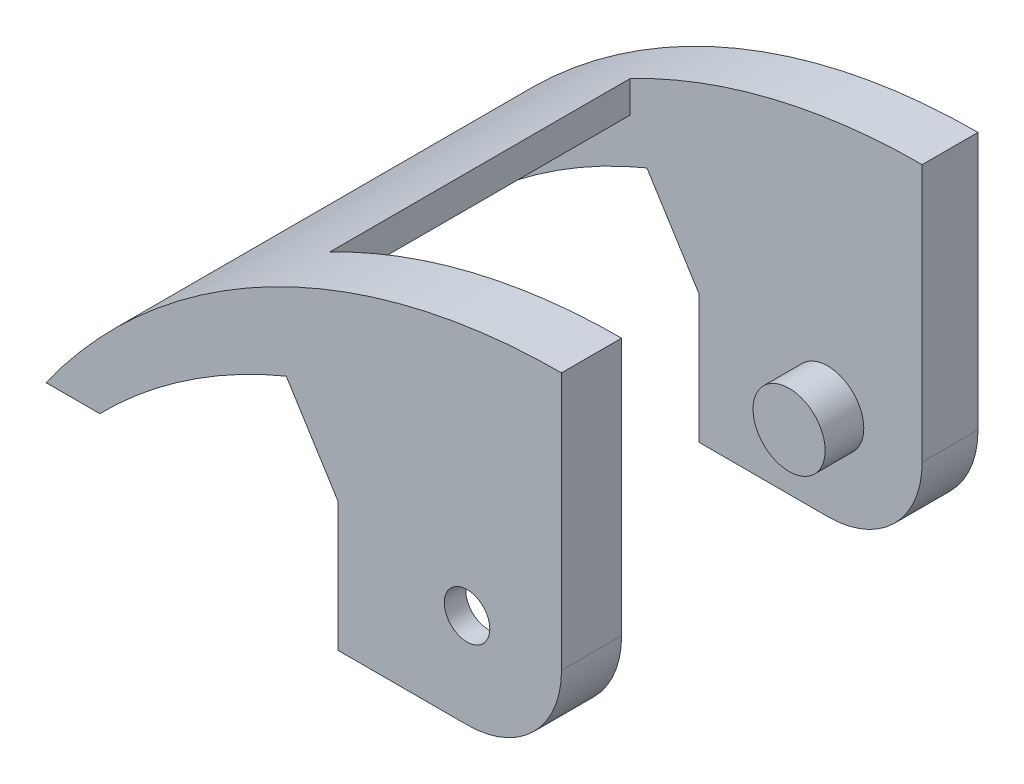
ISO-10303-21;
HEADER;
FILE_DESCRIPTION(('STEP AP214'),'2;1');
FILE_NAME('part.step','',(''),(''),'','','');
FILE_SCHEMA(('AUTOMOTIVE_DESIGN { 1 0 10303 214 1 1 1 1 }'));
ENDSEC;
DATA;
#1=APPLICATION_CONTEXT('core data for automotive mechanical design processes');
#2=APPLICATION_PROTOCOL_DEFINITION('international standard','automotive_design',2000,#1);
#3=PRODUCT_CONTEXT('',#1,'mechanical');
#4=PRODUCT('Part','Part','',(#3));
#5=PRODUCT_RELATED_PRODUCT_CATEGORY('part','',(#4));
#6=PRODUCT_DEFINITION_FORMATION('','',#4);
#7=PRODUCT_DEFINITION_CONTEXT('part definition',#1,'design');
#8=PRODUCT_DEFINITION('design','',#6,#7);
#9=PRODUCT_DEFINITION_SHAPE('','',#8);
#10=(LENGTH_UNIT() NAMED_UNIT(*) SI_UNIT(.MILLI.,.METRE.));
#11=(NAMED_UNIT(*) PLANE_ANGLE_UNIT() SI_UNIT($,.RADIAN.));
#12=(NAMED_UNIT(*) SI_UNIT($,.STERADIAN.) SOLID_ANGLE_UNIT());
#13=UNCERTAINTY_MEASURE_WITH_UNIT(LENGTH_MEASURE(1.E-05),#10,'distance_accuracy_value','');
#14=(GEOMETRIC_REPRESENTATION_CONTEXT(3) GLOBAL_UNCERTAINTY_ASSIGNED_CONTEXT((#13)) GLOBAL_UNIT_ASSIGNED_CONTEXT((#10,
#11,#12)) REPRESENTATION_CONTEXT('',''));
#15=CARTESIAN_POINT('',(0.,0.,0.));
#16=DIRECTION('',(0.,0.,1.));
#17=DIRECTION('',(1.,0.,0.));
#18=AXIS2_PLACEMENT_3D('',#15,#16,#17);
#19=CARTESIAN_POINT('',(0.,-11.,-7.));
#20=DIRECTION('',(0.,1.,0.));
#21=DIRECTION('',(-1.,0.,0.));
#22=AXIS2_PLACEMENT_3D('',#19,#20,#21);
#23=PLANE('',#22);
#24=DIRECTION('',(0.,0.,-1.));
#25=VECTOR('',#24,1.);
#26=CARTESIAN_POINT('',(-15.,-11.,0.));
#27=LINE('',#26,#25);
#28=CARTESIAN_POINT('',(-15.,-11.,-42.));
#29=VERTEX_POINT('',#28);
#30=CARTESIAN_POINT('',(-15.,-11.,-48.5));
#31=VERTEX_POINT('',#30);
#32=EDGE_CURVE('E243',#29,#31,#27,.T.);
#33=ORIENTED_EDGE('',*,*,#32,.T.);
#34=DIRECTION('',(-1.,0.,0.));
#35=VECTOR('',#34,1.);
#36=CARTESIAN_POINT('',(0.,-11.,-48.5));
#37=LINE('',#36,#35);
#38=CARTESIAN_POINT('',(0.,-11.,-48.5));
#39=VERTEX_POINT('',#38);
#40=EDGE_CURVE('E231',#39,#31,#37,.T.);
#41=ORIENTED_EDGE('',*,*,#40,.F.);
#42=DIRECTION('',(0.,0.,-1.));
#43=VECTOR('',#42,1.);
#44=CARTESIAN_POINT('',(0.,-11.,-41.5));
#45=LINE('',#44,#43);
#46=CARTESIAN_POINT('',(0.,-11.,-42.));
#47=VERTEX_POINT('',#46);
#48=EDGE_CURVE('E306',#47,#39,#45,.T.);
#49=ORIENTED_EDGE('',*,*,#48,.F.);
#50=DIRECTION('',(1.,0.,0.));
#51=VECTOR('',#50,1.);
#52=CARTESIAN_POINT('',(0.,-11.,-42.));
#53=LINE('',#52,#51);
#54=EDGE_CURVE('E287',#29,#47,#53,.T.);
#55=ORIENTED_EDGE('',*,*,#54,.F.);
#56=EDGE_LOOP('',(#33,#41,#49,#55));
#57=FACE_BOUND('',#56,.T.);
#58=ADVANCED_FACE('F47',(#57),#23,.F.);
#59=CARTESIAN_POINT('',(-15.,-11.,0.));
#60=VERTEX_POINT('',#59);
#61=CARTESIAN_POINT('',(-15.,-11.,-6.99999999999999));
#62=VERTEX_POINT('',#61);
#63=EDGE_CURVE('E241',#60,#62,#27,.T.);
#64=ORIENTED_EDGE('',*,*,#63,.T.);
#65=DIRECTION('',(-1.,0.,0.));
#66=VECTOR('',#65,1.);
#67=CARTESIAN_POINT('',(0.,-11.,-7.));
#68=LINE('',#67,#66);
#69=CARTESIAN_POINT('',(0.,-11.,-7.));
#70=VERTEX_POINT('',#69);
#71=EDGE_CURVE('E168',#70,#62,#68,.T.);
#72=ORIENTED_EDGE('',*,*,#71,.F.);
#73=DIRECTION('',(0.,0.,1.));
#74=VECTOR('',#73,1.);
#75=CARTESIAN_POINT('',(0.,-11.,-7.));
#76=LINE('',#75,#74);
#77=CARTESIAN_POINT('',(0.,-11.,0.));
#78=VERTEX_POINT('',#77);
#79=EDGE_CURVE('E172',#70,#78,#76,.T.);
#80=ORIENTED_EDGE('',*,*,#79,.T.);
#81=DIRECTION('',(-1.,0.,0.));
#82=VECTOR('',#81,1.);
#83=CARTESIAN_POINT('',(0.,-11.,0.));
#84=LINE('',#83,#82);
#85=EDGE_CURVE('E153',#78,#60,#84,.T.);
#86=ORIENTED_EDGE('',*,*,#85,.T.);
#87=EDGE_LOOP('',(#64,#72,#80,#86));
#88=FACE_BOUND('',#87,.T.);
#89=ADVANCED_FACE('F173',(#88),#23,.F.);
#90=CARTESIAN_POINT('',(0.,0.,-48.5));
#91=DIRECTION('',(0.,0.,1.));
#92=DIRECTION('',(1.,0.,0.));
#93=AXIS2_PLACEMENT_3D('',#90,#91,#92);
#94=CYLINDRICAL_SURFACE('',#93,11.);
#95=DIRECTION('',(0.,0.,1.));
#96=VECTOR('',#95,1.);
#97=CARTESIAN_POINT('',(11.,0.,-48.5));
#98=LINE('',#97,#96);
#99=CARTESIAN_POINT('',(11.,0.,-48.5));
#100=VERTEX_POINT('',#99);
#101=CARTESIAN_POINT('',(11.,0.,-42.));
#102=VERTEX_POINT('',#101);
#103=EDGE_CURVE('E197',#100,#102,#98,.T.);
#104=ORIENTED_EDGE('',*,*,#103,.T.);
#105=CARTESIAN_POINT('',(0.,0.,-42.));
#106=DIRECTION('',(0.,0.,1.));
#107=DIRECTION('',(1.,0.,0.));
#108=AXIS2_PLACEMENT_3D('',#105,#106,#107);
#109=CIRCLE('',#108,11.);
#110=EDGE_CURVE('E289',#47,#102,#109,.T.);
#111=ORIENTED_EDGE('',*,*,#110,.F.);
#112=ORIENTED_EDGE('',*,*,#48,.T.);
#113=CARTESIAN_POINT('',(0.,0.,-48.5));
#114=DIRECTION('',(0.,0.,1.));
#115=DIRECTION('',(1.,0.,0.));
#116=AXIS2_PLACEMENT_3D('',#113,#114,#115);
#117=CIRCLE('',#116,11.);
#118=EDGE_CURVE('E187',#39,#100,#117,.T.);
#119=ORIENTED_EDGE('',*,*,#118,.T.);
#120=EDGE_LOOP('',(#104,#111,#112,#119));
#121=FACE_BOUND('',#120,.T.);
#122=ADVANCED_FACE('F313',(#121),#94,.T.);
#123=CARTESIAN_POINT('',(11.,0.,-48.5));
#124=DIRECTION('',(-1.,0.,0.));
#125=DIRECTION('',(0.,0.,1.));
#126=AXIS2_PLACEMENT_3D('',#123,#124,#125);
#127=PLANE('',#126);
#128=DIRECTION('',(0.,1.,0.));
#129=VECTOR('',#128,1.);
#130=CARTESIAN_POINT('',(11.,0.,-42.));
#131=LINE('',#130,#129);
#132=CARTESIAN_POINT('',(11.,30.,-42.));
#133=VERTEX_POINT('',#132);
#134=EDGE_CURVE('E273',#102,#133,#131,.T.);
#135=ORIENTED_EDGE('',*,*,#134,.F.);
#136=ORIENTED_EDGE('',*,*,#103,.F.);
#137=DIRECTION('',(0.,-1.,0.));
#138=VECTOR('',#137,1.);
#139=CARTESIAN_POINT('',(11.,0.,-48.5));
#140=LINE('',#139,#138);
#141=CARTESIAN_POINT('',(11.,30.,-48.5));
#142=VERTEX_POINT('',#141);
#143=EDGE_CURVE('E184',#142,#100,#140,.T.);
#144=ORIENTED_EDGE('',*,*,#143,.F.);
#145=DIRECTION('',(0.,0.,1.));
#146=VECTOR('',#145,1.);
#147=CARTESIAN_POINT('',(11.,30.,-48.5));
#148=LINE('',#147,#146);
#149=EDGE_CURVE('E192',#142,#133,#148,.T.);
#150=ORIENTED_EDGE('',*,*,#149,.T.);
#151=EDGE_LOOP('',(#135,#136,#144,#150));
#152=FACE_BOUND('',#151,.T.);
#153=ADVANCED_FACE('F321',(#152),#127,.F.);
#154=CARTESIAN_POINT('',(12.,-12.,-7.));
#155=DIRECTION('',(0.,0.,1.));
#156=DIRECTION('',(0.,-1.,0.));
#157=AXIS2_PLACEMENT_3D('',#154,#155,#156);
#158=PLANE('',#157);
#159=CARTESIAN_POINT('',(4.0356171846875,-46.997919770761,-7.));
#160=DIRECTION('',(0.,0.,1.));
#161=DIRECTION('',(0.,-1.,0.));
#162=AXIS2_PLACEMENT_3D('',#159,#160,#161);
#163=CIRCLE('',#162,65.6219512195122);
#164=CARTESIAN_POINT('',(-21.0566776477634,13.63719564842,-7.));
#165=VERTEX_POINT('',#164);
#166=CARTESIAN_POINT('',(-42.766432541993,-1.00000000000001,-6.99999999999999));
#167=VERTEX_POINT('',#166);
#168=EDGE_CURVE('E234',#165,#167,#163,.T.);
#169=ORIENTED_EDGE('',*,*,#168,.T.);
#170=DIRECTION('',(-1.,0.,0.));
#171=VECTOR('',#170,1.);
#172=CARTESIAN_POINT('',(12.,-1.00000000000002,-7.));
#173=LINE('',#172,#171);
#174=CARTESIAN_POINT('',(-45.3101169266472,-1.00000000000002,-6.99999999999999));
#175=VERTEX_POINT('',#174);
#176=EDGE_CURVE('E270',#167,#175,#173,.T.);
#177=ORIENTED_EDGE('',*,*,#176,.T.);
#178=CARTESIAN_POINT('',(11.,-43.6219512195122,-7.));
#179=DIRECTION('',(0.,0.,1.));
#180=DIRECTION('',(0.,-1.,0.));
#181=AXIS2_PLACEMENT_3D('',#178,#179,#180);
#182=CIRCLE('',#181,70.6219512195122);
#183=CARTESIAN_POINT('',(-23.499204656792,18.,-6.99999999999999));
#184=VERTEX_POINT('',#183);
#185=EDGE_CURVE('E296',#184,#175,#182,.T.);
#186=ORIENTED_EDGE('',*,*,#185,.F.);
#187=DIRECTION('',(1.,0.,0.));
#188=VECTOR('',#187,1.);
#189=CARTESIAN_POINT('',(0.,18.,-7.));
#190=LINE('',#189,#188);
#191=CARTESIAN_POINT('',(-23.,18.,-7.));
#192=VERTEX_POINT('',#191);
#193=EDGE_CURVE('E178',#184,#192,#190,.T.);
#194=ORIENTED_EDGE('',*,*,#193,.T.);
#195=DIRECTION('',(0.,1.,0.));
#196=VECTOR('',#195,1.);
#197=CARTESIAN_POINT('',(-23.,15.5,-6.99999999999999));
#198=LINE('',#197,#196);
#199=CARTESIAN_POINT('',(-23.,21.6788274999505,-6.99999999999999));
#200=VERTEX_POINT('',#199);
#201=EDGE_CURVE('E204',#192,#200,#198,.T.);
#202=ORIENTED_EDGE('',*,*,#201,.T.);
#203=CARTESIAN_POINT('',(11.,-43.6219512195122,-7.));
#204=DIRECTION('',(0.,0.,1.));
#205=DIRECTION('',(0.,-1.,0.));
#206=AXIS2_PLACEMENT_3D('',#203,#204,#205);
#207=CIRCLE('',#206,73.6219512195122);
#208=CARTESIAN_POINT('',(11.,30.,-7.00000000000003));
#209=VERTEX_POINT('',#208);
#210=EDGE_CURVE('E232',#200,#209,#207,.F.);
#211=ORIENTED_EDGE('',*,*,#210,.T.);
#212=DIRECTION('',(0.,-1.,0.));
#213=VECTOR('',#212,1.);
#214=CARTESIAN_POINT('',(11.,-12.,-7.));
#215=LINE('',#214,#213);
#216=CARTESIAN_POINT('',(11.,0.,-7.00000000000001));
#217=VERTEX_POINT('',#216);
#218=EDGE_CURVE('E201',#209,#217,#215,.T.);
#219=ORIENTED_EDGE('',*,*,#218,.T.);
#220=CARTESIAN_POINT('',(0.,0.,-7.));
#221=DIRECTION('',(0.,0.,1.));
#222=DIRECTION('',(0.,-1.,0.));
#223=AXIS2_PLACEMENT_3D('',#220,#221,#222);
#224=CIRCLE('',#223,11.);
#225=EDGE_CURVE('E195',#70,#217,#224,.T.);
#226=ORIENTED_EDGE('',*,*,#225,.F.);
#227=ORIENTED_EDGE('',*,*,#71,.T.);
#228=DIRECTION('',(0.,-1.,0.));
#229=VECTOR('',#228,1.);
#230=CARTESIAN_POINT('',(-15.,-12.,-7.));
#231=LINE('',#230,#229);
#232=CARTESIAN_POINT('',(-15.,4.,-7.));
#233=VERTEX_POINT('',#232);
#234=EDGE_CURVE('E264',#233,#62,#231,.T.);
#235=ORIENTED_EDGE('',*,*,#234,.F.);
#236=DIRECTION('',(-0.532109313727595,0.846675662957397,0.));
#237=VECTOR('',#236,1.);
#238=CARTESIAN_POINT('',(-0.146827217139534,-19.6339030129947,-7.));
#239=LINE('',#238,#237);
#240=EDGE_CURVE('E260',#233,#165,#239,.T.);
#241=ORIENTED_EDGE('',*,*,#240,.T.);
#242=EDGE_LOOP('',(#169,#177,#186,#194,#202,#211,#219,#226,#227,#235,#241));
#243=FACE_BOUND('',#242,.T.);
#244=CARTESIAN_POINT('',(0.,0.,-7.));
#245=DIRECTION('',(0.,0.,-1.));
#246=DIRECTION('',(0.,1.,0.));
#247=AXIS2_PLACEMENT_3D('',#244,#245,#246);
#248=CIRCLE('',#247,9.5);
#249=CARTESIAN_POINT('',(0.,9.5,-7.));
#250=VERTEX_POINT('',#249);
#251=EDGE_CURVE('E213',#250,#250,#248,.T.);
#252=ORIENTED_EDGE('',*,*,#251,.F.);
#253=EDGE_LOOP('',(#252));
#254=FACE_BOUND('',#253,.T.);
#255=ADVANCED_FACE('F392',(#243,#254),#158,.F.);
#256=CARTESIAN_POINT('',(12.,18.,-7.));
#257=DIRECTION('',(0.,1.,0.));
#258=DIRECTION('',(0.,0.,1.));
#259=AXIS2_PLACEMENT_3D('',#256,#257,#258);
#260=PLANE('',#259);
#261=DIRECTION('',(0.,0.,1.));
#262=VECTOR('',#261,1.);
#263=CARTESIAN_POINT('',(-23.499204656792,18.,-41.5));
#264=LINE('',#263,#262);
#265=CARTESIAN_POINT('',(-23.499204656792,18.,-42.));
#266=VERTEX_POINT('',#265);
#267=EDGE_CURVE('E294',#266,#184,#264,.T.);
#268=ORIENTED_EDGE('',*,*,#267,.F.);
#269=DIRECTION('',(-1.,0.,0.));
#270=VECTOR('',#269,1.);
#271=CARTESIAN_POINT('',(0.,18.,-42.));
#272=LINE('',#271,#270);
#273=CARTESIAN_POINT('',(-23.,18.,-42.));
#274=VERTEX_POINT('',#273);
#275=EDGE_CURVE('E281',#274,#266,#272,.T.);
#276=ORIENTED_EDGE('',*,*,#275,.F.);
#277=DIRECTION('',(0.,0.,1.));
#278=VECTOR('',#277,1.);
#279=CARTESIAN_POINT('',(-23.,18.,-6.99999999999999));
#280=LINE('',#279,#278);
#281=EDGE_CURVE('E219',#274,#192,#280,.T.);
#282=ORIENTED_EDGE('',*,*,#281,.T.);
#283=ORIENTED_EDGE('',*,*,#193,.F.);
#284=EDGE_LOOP('',(#268,#276,#282,#283));
#285=FACE_BOUND('',#284,.T.);
#286=ADVANCED_FACE('F442',(#285),#260,.F.);
#287=CARTESIAN_POINT('',(0.,0.,0.));
#288=DIRECTION('',(0.,0.,1.));
#289=DIRECTION('',(1.,0.,0.));
#290=AXIS2_PLACEMENT_3D('',#287,#288,#289);
#291=PLANE('',#290);
#292=DIRECTION('',(1.,0.,0.));
#293=VECTOR('',#292,1.);
#294=CARTESIAN_POINT('',(0.,-1.00000000000002,0.));
#295=LINE('',#294,#293);
#296=CARTESIAN_POINT('',(-49.0296674620954,-1.00000000000001,0.));
#297=VERTEX_POINT('',#296);
#298=CARTESIAN_POINT('',(-42.766432541993,-1.00000000000001,0.));
#299=VERTEX_POINT('',#298);
#300=EDGE_CURVE('E367',#297,#299,#295,.T.);
#301=ORIENTED_EDGE('',*,*,#300,.T.);
#302=CARTESIAN_POINT('',(4.0356171846875,-46.997919770761,0.));
#303=DIRECTION('',(0.,0.,-1.));
#304=DIRECTION('',(-1.,0.,0.));
#305=AXIS2_PLACEMENT_3D('',#302,#303,#304);
#306=CIRCLE('',#305,65.6219512195122);
#307=CARTESIAN_POINT('',(-21.0566776477634,13.63719564842,0.));
#308=VERTEX_POINT('',#307);
#309=EDGE_CURVE('E370',#299,#308,#306,.T.);
#310=ORIENTED_EDGE('',*,*,#309,.T.);
#311=DIRECTION('',(0.532109313727595,-0.846675662957397,0.));
#312=VECTOR('',#311,1.);
#313=CARTESIAN_POINT('',(-8.95079914980076,-5.62529880246915,0.));
#314=LINE('',#313,#312);
#315=CARTESIAN_POINT('',(-15.,4.,0.));
#316=VERTEX_POINT('',#315);
#317=EDGE_CURVE('E373',#308,#316,#314,.T.);
#318=ORIENTED_EDGE('',*,*,#317,.T.);
#319=DIRECTION('',(0.,1.,0.));
#320=VECTOR('',#319,1.);
#321=CARTESIAN_POINT('',(-15.,0.,0.));
#322=LINE('',#321,#320);
#323=EDGE_CURVE('E165',#60,#316,#322,.T.);
#324=ORIENTED_EDGE('',*,*,#323,.F.);
#325=ORIENTED_EDGE('',*,*,#85,.F.);
#326=CARTESIAN_POINT('',(0.,0.,0.));
#327=DIRECTION('',(0.,0.,1.));
#328=DIRECTION('',(1.,0.,0.));
#329=AXIS2_PLACEMENT_3D('',#326,#327,#328);
#330=CIRCLE('',#329,11.);
#331=CARTESIAN_POINT('',(11.,0.,0.));
#332=VERTEX_POINT('',#331);
#333=EDGE_CURVE('E160',#78,#332,#330,.T.);
#334=ORIENTED_EDGE('',*,*,#333,.T.);
#335=DIRECTION('',(0.,-1.,0.));
#336=VECTOR('',#335,1.);
#337=CARTESIAN_POINT('',(11.,0.,0.));
#338=LINE('',#337,#336);
#339=CARTESIAN_POINT('',(11.,30.,0.));
#340=VERTEX_POINT('',#339);
#341=EDGE_CURVE('E177',#340,#332,#338,.T.);
#342=ORIENTED_EDGE('',*,*,#341,.F.);
#343=CARTESIAN_POINT('',(11.,-43.6219512195122,0.));
#344=DIRECTION('',(0.,0.,1.));
#345=DIRECTION('',(1.,0.,0.));
#346=AXIS2_PLACEMENT_3D('',#343,#344,#345);
#347=CIRCLE('',#346,73.6219512195122);
#348=EDGE_CURVE('E169',#297,#340,#347,.F.);
#349=ORIENTED_EDGE('',*,*,#348,.F.);
#350=EDGE_LOOP('',(#301,#310,#318,#324,#325,#334,#342,#349));
#351=FACE_BOUND('',#350,.T.);
#352=CARTESIAN_POINT('',(0.,0.,0.));
#353=DIRECTION('',(0.,0.,1.));
#354=DIRECTION('',(1.,0.,0.));
#355=AXIS2_PLACEMENT_3D('',#352,#353,#354);
#356=CIRCLE('',#355,2.65);
#357=CARTESIAN_POINT('',(2.65,0.,0.));
#358=VERTEX_POINT('',#357);
#359=EDGE_CURVE('E209',#358,#358,#356,.T.);
#360=ORIENTED_EDGE('',*,*,#359,.F.);
#361=EDGE_LOOP('',(#360));
#362=FACE_BOUND('',#361,.T.);
#363=ADVANCED_FACE('F156',(#351,#362),#291,.T.);
#364=CARTESIAN_POINT('',(0.,0.,-48.5));
#365=DIRECTION('',(0.,0.,-1.));
#366=DIRECTION('',(-1.,0.,0.));
#367=AXIS2_PLACEMENT_3D('',#364,#365,#366);
#368=PLANE('',#367);
#369=DIRECTION('',(-1.,0.,0.));
#370=VECTOR('',#369,1.);
#371=CARTESIAN_POINT('',(0.,-1.00000000000002,-48.5));
#372=LINE('',#371,#370);
#373=CARTESIAN_POINT('',(-49.0296674620954,-1.00000000000001,-48.5));
#374=VERTEX_POINT('',#373);
#375=CARTESIAN_POINT('',(-42.766432541993,-1.00000000000001,-48.5));
#376=VERTEX_POINT('',#375);
#377=EDGE_CURVE('E51',#374,#376,#372,.F.);
#378=ORIENTED_EDGE('',*,*,#377,.F.);
#379=CARTESIAN_POINT('',(11.,-43.6219512195122,-48.5));
#380=DIRECTION('',(0.,0.,1.));
#381=DIRECTION('',(1.,0.,0.));
#382=AXIS2_PLACEMENT_3D('',#379,#380,#381);
#383=CIRCLE('',#382,73.6219512195122);
#384=EDGE_CURVE('E230',#374,#142,#383,.F.);
#385=ORIENTED_EDGE('',*,*,#384,.T.);
#386=ORIENTED_EDGE('',*,*,#143,.T.);
#387=ORIENTED_EDGE('',*,*,#118,.F.);
#388=ORIENTED_EDGE('',*,*,#40,.T.);
#389=DIRECTION('',(0.,1.,0.));
#390=VECTOR('',#389,1.);
#391=CARTESIAN_POINT('',(-15.,0.,-48.5));
#392=LINE('',#391,#390);
#393=CARTESIAN_POINT('',(-15.,4.,-48.5));
#394=VERTEX_POINT('',#393);
#395=EDGE_CURVE('E94',#31,#394,#392,.T.);
#396=ORIENTED_EDGE('',*,*,#395,.T.);
#397=DIRECTION('',(0.532109313727595,-0.846675662957397,0.));
#398=VECTOR('',#397,1.);
#399=CARTESIAN_POINT('',(-8.95079914980076,-5.62529880246915,-48.5));
#400=LINE('',#399,#398);
#401=CARTESIAN_POINT('',(-21.0566776477634,13.63719564842,-48.5));
#402=VERTEX_POINT('',#401);
#403=EDGE_CURVE('E239',#402,#394,#400,.T.);
#404=ORIENTED_EDGE('',*,*,#403,.F.);
#405=CARTESIAN_POINT('',(4.0356171846875,-46.997919770761,-48.5));
#406=DIRECTION('',(0.,0.,-1.));
#407=DIRECTION('',(-1.,0.,0.));
#408=AXIS2_PLACEMENT_3D('',#405,#406,#407);
#409=CIRCLE('',#408,65.6219512195122);
#410=EDGE_CURVE('E233',#376,#402,#409,.T.);
#411=ORIENTED_EDGE('',*,*,#410,.F.);
#412=EDGE_LOOP('',(#378,#385,#386,#387,#388,#396,#404,#411));
#413=FACE_BOUND('',#412,.T.);
#414=ADVANCED_FACE('F322',(#413),#368,.T.);
#415=ORIENTED_EDGE('',*,*,#333,.F.);
#416=ORIENTED_EDGE('',*,*,#79,.F.);
#417=ORIENTED_EDGE('',*,*,#225,.T.);
#418=EDGE_CURVE('E182',#217,#332,#98,.T.);
#419=ORIENTED_EDGE('',*,*,#418,.T.);
#420=EDGE_LOOP('',(#415,#416,#417,#419));
#421=FACE_BOUND('',#420,.T.);
#422=ADVANCED_FACE('F180',(#421),#94,.T.);
#423=CARTESIAN_POINT('',(0.,0.,-48.));
#424=DIRECTION('',(0.,0.,1.));
#425=DIRECTION('',(1.,0.,0.));
#426=AXIS2_PLACEMENT_3D('',#423,#424,#425);
#427=CYLINDRICAL_SURFACE('',#426,2.65);
#428=ORIENTED_EDGE('',*,*,#359,.T.);
#429=EDGE_LOOP('',(#428));
#430=FACE_BOUND('',#429,.T.);
#431=CARTESIAN_POINT('',(0.,0.,-2.5));
#432=DIRECTION('',(0.,0.,-1.));
#433=DIRECTION('',(0.,1.,0.));
#434=AXIS2_PLACEMENT_3D('',#431,#432,#433);
#435=CIRCLE('',#434,2.65);
#436=CARTESIAN_POINT('',(0.,2.65,-2.5));
#437=VERTEX_POINT('',#436);
#438=EDGE_CURVE('E210',#437,#437,#435,.F.);
#439=ORIENTED_EDGE('',*,*,#438,.F.);
#440=EDGE_LOOP('',(#439));
#441=FACE_BOUND('',#440,.T.);
#442=ADVANCED_FACE('F49',(#430,#441),#427,.F.);
#443=CARTESIAN_POINT('',(0.,0.,-2.5));
#444=DIRECTION('',(0.,0.,-1.));
#445=DIRECTION('',(0.,1.,0.));
#446=AXIS2_PLACEMENT_3D('',#443,#444,#445);
#447=PLANE('',#446);
#448=CARTESIAN_POINT('',(0.,0.,-2.5));
#449=DIRECTION('',(0.,0.,-1.));
#450=DIRECTION('',(0.,1.,0.));
#451=AXIS2_PLACEMENT_3D('',#448,#449,#450);
#452=CIRCLE('',#451,9.5);
#453=CARTESIAN_POINT('',(0.,9.5,-2.5));
#454=VERTEX_POINT('',#453);
#455=EDGE_CURVE('E214',#454,#454,#452,.T.);
#456=ORIENTED_EDGE('',*,*,#455,.T.);
#457=EDGE_LOOP('',(#456));
#458=FACE_BOUND('',#457,.T.);
#459=ORIENTED_EDGE('',*,*,#438,.T.);
#460=EDGE_LOOP('',(#459));
#461=FACE_BOUND('',#460,.T.);
#462=ADVANCED_FACE('F449',(#458,#461),#447,.T.);
#463=CARTESIAN_POINT('',(0.,0.,-2.5));
#464=DIRECTION('',(0.,0.,-1.));
#465=DIRECTION('',(0.,1.,0.));
#466=AXIS2_PLACEMENT_3D('',#463,#464,#465);
#467=CYLINDRICAL_SURFACE('',#466,9.5);
#468=ORIENTED_EDGE('',*,*,#455,.F.);
#469=EDGE_LOOP('',(#468));
#470=FACE_BOUND('',#469,.T.);
#471=ORIENTED_EDGE('',*,*,#251,.T.);
#472=EDGE_LOOP('',(#471));
#473=FACE_BOUND('',#472,.T.);
#474=ADVANCED_FACE('F431',(#470,#473),#467,.F.);
#475=CARTESIAN_POINT('',(-23.,15.5,-41.));
#476=DIRECTION('',(-1.,0.,0.));
#477=DIRECTION('',(0.,0.,1.));
#478=AXIS2_PLACEMENT_3D('',#475,#476,#477);
#479=PLANE('',#478);
#480=DIRECTION('',(0.,0.,1.));
#481=VECTOR('',#480,1.);
#482=CARTESIAN_POINT('',(-23.,21.6788274999505,-48.5));
#483=LINE('',#482,#481);
#484=CARTESIAN_POINT('',(-23.,21.6788274999505,-42.));
#485=VERTEX_POINT('',#484);
#486=EDGE_CURVE('E299',#485,#200,#483,.T.);
#487=ORIENTED_EDGE('',*,*,#486,.T.);
#488=ORIENTED_EDGE('',*,*,#201,.F.);
#489=ORIENTED_EDGE('',*,*,#281,.F.);
#490=DIRECTION('',(0.,-1.,0.));
#491=VECTOR('',#490,1.);
#492=CARTESIAN_POINT('',(-23.,0.,-42.));
#493=LINE('',#492,#491);
#494=EDGE_CURVE('E278',#485,#274,#493,.T.);
#495=ORIENTED_EDGE('',*,*,#494,.F.);
#496=EDGE_LOOP('',(#487,#488,#489,#495));
#497=FACE_BOUND('',#496,.T.);
#498=ADVANCED_FACE('F428',(#497),#479,.F.);
#499=EDGE_CURVE('E196',#209,#340,#148,.T.);
#500=ORIENTED_EDGE('',*,*,#499,.T.);
#501=ORIENTED_EDGE('',*,*,#341,.T.);
#502=ORIENTED_EDGE('',*,*,#418,.F.);
#503=ORIENTED_EDGE('',*,*,#218,.F.);
#504=EDGE_LOOP('',(#500,#501,#502,#503));
#505=FACE_BOUND('',#504,.T.);
#506=ADVANCED_FACE('F421',(#505),#127,.F.);
#507=CARTESIAN_POINT('',(11.,-43.6219512195122,-7.));
#508=DIRECTION('',(0.,0.,1.));
#509=DIRECTION('',(1.,0.,0.));
#510=AXIS2_PLACEMENT_3D('',#507,#508,#509);
#511=CYLINDRICAL_SURFACE('',#510,73.6219512195122);
#512=ORIENTED_EDGE('',*,*,#384,.F.);
#513=DIRECTION('',(0.,0.,-1.));
#514=VECTOR('',#513,1.);
#515=CARTESIAN_POINT('',(-49.0296674620954,-1.00000000000001,0.));
#516=LINE('',#515,#514);
#517=EDGE_CURVE('E83',#297,#374,#516,.T.);
#518=ORIENTED_EDGE('',*,*,#517,.F.);
#519=ORIENTED_EDGE('',*,*,#348,.T.);
#520=ORIENTED_EDGE('',*,*,#499,.F.);
#521=ORIENTED_EDGE('',*,*,#210,.F.);
#522=ORIENTED_EDGE('',*,*,#486,.F.);
#523=CARTESIAN_POINT('',(11.,-43.6219512195122,-42.));
#524=DIRECTION('',(0.,0.,1.));
#525=DIRECTION('',(1.,0.,0.));
#526=AXIS2_PLACEMENT_3D('',#523,#524,#525);
#527=CIRCLE('',#526,73.6219512195122);
#528=EDGE_CURVE('E275',#133,#485,#527,.T.);
#529=ORIENTED_EDGE('',*,*,#528,.F.);
#530=ORIENTED_EDGE('',*,*,#149,.F.);
#531=EDGE_LOOP('',(#512,#518,#519,#520,#521,#522,#529,#530));
#532=FACE_BOUND('',#531,.T.);
#533=ADVANCED_FACE('F327',(#532),#511,.T.);
#534=CARTESIAN_POINT('',(11.,-43.6219512195122,-41.5));
#535=DIRECTION('',(0.,0.,1.));
#536=DIRECTION('',(1.,0.,0.));
#537=AXIS2_PLACEMENT_3D('',#534,#535,#536);
#538=CYLINDRICAL_SURFACE('',#537,70.6219512195122);
#539=ORIENTED_EDGE('',*,*,#185,.T.);
#540=DIRECTION('',(0.,0.,1.));
#541=VECTOR('',#540,1.);
#542=CARTESIAN_POINT('',(-45.3101169266472,-1.00000000000002,-41.5));
#543=LINE('',#542,#541);
#544=CARTESIAN_POINT('',(-45.3101169266472,-1.00000000000001,-42.));
#545=VERTEX_POINT('',#544);
#546=EDGE_CURVE('E267',#175,#545,#543,.F.);
#547=ORIENTED_EDGE('',*,*,#546,.T.);
#548=CARTESIAN_POINT('',(11.,-43.6219512195122,-42.));
#549=DIRECTION('',(0.,0.,1.));
#550=DIRECTION('',(1.,0.,0.));
#551=AXIS2_PLACEMENT_3D('',#548,#549,#550);
#552=CIRCLE('',#551,70.6219512195122);
#553=EDGE_CURVE('E284',#266,#545,#552,.T.);
#554=ORIENTED_EDGE('',*,*,#553,.F.);
#555=ORIENTED_EDGE('',*,*,#267,.T.);
#556=EDGE_LOOP('',(#539,#547,#554,#555));
#557=FACE_BOUND('',#556,.T.);
#558=ADVANCED_FACE('F389',(#557),#538,.F.);
#559=CARTESIAN_POINT('',(0.,0.,-42.));
#560=DIRECTION('',(0.,0.,1.));
#561=DIRECTION('',(1.,0.,0.));
#562=AXIS2_PLACEMENT_3D('',#559,#560,#561);
#563=PLANE('',#562);
#564=DIRECTION('',(-1.,0.,0.));
#565=VECTOR('',#564,1.);
#566=CARTESIAN_POINT('',(0.,-1.00000000000002,-42.));
#567=LINE('',#566,#565);
#568=CARTESIAN_POINT('',(-42.766432541993,-1.00000000000001,-42.));
#569=VERTEX_POINT('',#568);
#570=EDGE_CURVE('E11',#569,#545,#567,.T.);
#571=ORIENTED_EDGE('',*,*,#570,.F.);
#572=CARTESIAN_POINT('',(4.0356171846875,-46.997919770761,-42.));
#573=DIRECTION('',(0.,0.,1.));
#574=DIRECTION('',(1.,0.,0.));
#575=AXIS2_PLACEMENT_3D('',#572,#573,#574);
#576=CIRCLE('',#575,65.6219512195122);
#577=CARTESIAN_POINT('',(-21.0566776477634,13.63719564842,-42.));
#578=VERTEX_POINT('',#577);
#579=EDGE_CURVE('E224',#578,#569,#576,.T.);
#580=ORIENTED_EDGE('',*,*,#579,.F.);
#581=DIRECTION('',(-0.532109313727595,0.846675662957397,0.));
#582=VECTOR('',#581,1.);
#583=CARTESIAN_POINT('',(-8.95079914980076,-5.62529880246915,-42.));
#584=LINE('',#583,#582);
#585=CARTESIAN_POINT('',(-15.,4.,-42.));
#586=VERTEX_POINT('',#585);
#587=EDGE_CURVE('E226',#586,#578,#584,.T.);
#588=ORIENTED_EDGE('',*,*,#587,.F.);
#589=DIRECTION('',(0.,-1.,0.));
#590=VECTOR('',#589,1.);
#591=CARTESIAN_POINT('',(-15.,0.,-42.));
#592=LINE('',#591,#590);
#593=EDGE_CURVE('E57',#586,#29,#592,.T.);
#594=ORIENTED_EDGE('',*,*,#593,.T.);
#595=ORIENTED_EDGE('',*,*,#54,.T.);
#596=ORIENTED_EDGE('',*,*,#110,.T.);
#597=ORIENTED_EDGE('',*,*,#134,.T.);
#598=ORIENTED_EDGE('',*,*,#528,.T.);
#599=ORIENTED_EDGE('',*,*,#494,.T.);
#600=ORIENTED_EDGE('',*,*,#275,.T.);
#601=ORIENTED_EDGE('',*,*,#553,.T.);
#602=EDGE_LOOP('',(#571,#580,#588,#594,#595,#596,#597,#598,#599,#600,#601));
#603=FACE_BOUND('',#602,.T.);
#604=CARTESIAN_POINT('',(0.,0.,-42.));
#605=DIRECTION('',(0.,0.,1.));
#606=DIRECTION('',(1.,0.,0.));
#607=AXIS2_PLACEMENT_3D('',#604,#605,#606);
#608=CIRCLE('',#607,4.2);
#609=CARTESIAN_POINT('',(4.2,0.,-42.));
#610=VERTEX_POINT('',#609);
#611=EDGE_CURVE('E291',#610,#610,#608,.F.);
#612=ORIENTED_EDGE('',*,*,#611,.T.);
#613=EDGE_LOOP('',(#612));
#614=FACE_BOUND('',#613,.T.);
#615=ADVANCED_FACE('F332',(#603,#614),#563,.T.);
#616=CARTESIAN_POINT('',(0.,0.,-37.5));
#617=DIRECTION('',(0.,0.,1.));
#618=DIRECTION('',(1.,0.,0.));
#619=AXIS2_PLACEMENT_3D('',#616,#617,#618);
#620=PLANE('',#619);
#621=CARTESIAN_POINT('',(0.,0.,-37.5));
#622=DIRECTION('',(0.,0.,1.));
#623=DIRECTION('',(1.,0.,0.));
#624=AXIS2_PLACEMENT_3D('',#621,#622,#623);
#625=CIRCLE('',#624,4.2);
#626=CARTESIAN_POINT('',(4.2,0.,-37.5));
#627=VERTEX_POINT('',#626);
#628=EDGE_CURVE('E206',#627,#627,#625,.T.);
#629=ORIENTED_EDGE('',*,*,#628,.T.);
#630=EDGE_LOOP('',(#629));
#631=FACE_BOUND('',#630,.T.);
#632=ADVANCED_FACE('F433',(#631),#620,.T.);
#633=CARTESIAN_POINT('',(0.,0.,-37.5));
#634=DIRECTION('',(0.,0.,-1.));
#635=DIRECTION('',(-1.,0.,0.));
#636=AXIS2_PLACEMENT_3D('',#633,#634,#635);
#637=CYLINDRICAL_SURFACE('',#636,4.2);
#638=ORIENTED_EDGE('',*,*,#628,.F.);
#639=EDGE_LOOP('',(#638));
#640=FACE_BOUND('',#639,.T.);
#641=ORIENTED_EDGE('',*,*,#611,.F.);
#642=EDGE_LOOP('',(#641));
#643=FACE_BOUND('',#642,.T.);
#644=ADVANCED_FACE('F436',(#640,#643),#637,.T.);
#645=CARTESIAN_POINT('',(0.,-1.00000000000002,0.));
#646=DIRECTION('',(0.,1.,0.));
#647=DIRECTION('',(-1.,0.,0.));
#648=AXIS2_PLACEMENT_3D('',#645,#646,#647);
#649=PLANE('',#648);
#650=ORIENTED_EDGE('',*,*,#377,.T.);
#651=DIRECTION('',(0.,0.,-1.));
#652=VECTOR('',#651,1.);
#653=CARTESIAN_POINT('',(-42.766432541993,-1.00000000000001,0.));
#654=LINE('',#653,#652);
#655=EDGE_CURVE('E251',#569,#376,#654,.T.);
#656=ORIENTED_EDGE('',*,*,#655,.F.);
#657=ORIENTED_EDGE('',*,*,#570,.T.);
#658=ORIENTED_EDGE('',*,*,#546,.F.);
#659=ORIENTED_EDGE('',*,*,#176,.F.);
#660=EDGE_CURVE('E248',#299,#167,#654,.T.);
#661=ORIENTED_EDGE('',*,*,#660,.F.);
#662=ORIENTED_EDGE('',*,*,#300,.F.);
#663=ORIENTED_EDGE('',*,*,#517,.T.);
#664=EDGE_LOOP('',(#650,#656,#657,#658,#659,#661,#662,#663));
#665=FACE_BOUND('',#664,.T.);
#666=ADVANCED_FACE('F366',(#665),#649,.F.);
#667=CARTESIAN_POINT('',(-15.,0.,0.));
#668=DIRECTION('',(-1.,0.,0.));
#669=DIRECTION('',(0.,-1.,0.));
#670=AXIS2_PLACEMENT_3D('',#667,#668,#669);
#671=PLANE('',#670);
#672=ORIENTED_EDGE('',*,*,#234,.T.);
#673=ORIENTED_EDGE('',*,*,#63,.F.);
#674=ORIENTED_EDGE('',*,*,#323,.T.);
#675=DIRECTION('',(0.,0.,-1.));
#676=VECTOR('',#675,1.);
#677=CARTESIAN_POINT('',(-15.,4.,0.));
#678=LINE('',#677,#676);
#679=EDGE_CURVE('E247',#316,#233,#678,.T.);
#680=ORIENTED_EDGE('',*,*,#679,.T.);
#681=EDGE_LOOP('',(#672,#673,#674,#680));
#682=FACE_BOUND('',#681,.T.);
#683=ADVANCED_FACE('F408',(#682),#671,.T.);
#684=CARTESIAN_POINT('',(-8.95079914980076,-5.62529880246915,0.));
#685=DIRECTION('',(0.846675662957397,0.532109313727595,0.));
#686=DIRECTION('',(-0.532109313727595,0.846675662957397,0.));
#687=AXIS2_PLACEMENT_3D('',#684,#685,#686);
#688=PLANE('',#687);
#689=ORIENTED_EDGE('',*,*,#679,.F.);
#690=ORIENTED_EDGE('',*,*,#317,.F.);
#691=DIRECTION('',(0.,0.,-1.));
#692=VECTOR('',#691,1.);
#693=CARTESIAN_POINT('',(-21.0566776477634,13.63719564842,0.));
#694=LINE('',#693,#692);
#695=EDGE_CURVE('E252',#308,#165,#694,.T.);
#696=ORIENTED_EDGE('',*,*,#695,.T.);
#697=ORIENTED_EDGE('',*,*,#240,.F.);
#698=EDGE_LOOP('',(#689,#690,#696,#697));
#699=FACE_BOUND('',#698,.T.);
#700=ADVANCED_FACE('F397',(#699),#688,.F.);
#701=CARTESIAN_POINT('',(4.0356171846875,-46.997919770761,0.));
#702=DIRECTION('',(0.,0.,-1.));
#703=DIRECTION('',(-1.,0.,0.));
#704=AXIS2_PLACEMENT_3D('',#701,#702,#703);
#705=CYLINDRICAL_SURFACE('',#704,65.6219512195122);
#706=ORIENTED_EDGE('',*,*,#695,.F.);
#707=ORIENTED_EDGE('',*,*,#309,.F.);
#708=ORIENTED_EDGE('',*,*,#660,.T.);
#709=ORIENTED_EDGE('',*,*,#168,.F.);
#710=EDGE_LOOP('',(#706,#707,#708,#709));
#711=FACE_BOUND('',#710,.T.);
#712=ADVANCED_FACE('F371',(#711),#705,.F.);
#713=ORIENTED_EDGE('',*,*,#32,.F.);
#714=ORIENTED_EDGE('',*,*,#593,.F.);
#715=EDGE_CURVE('E255',#586,#394,#678,.T.);
#716=ORIENTED_EDGE('',*,*,#715,.T.);
#717=ORIENTED_EDGE('',*,*,#395,.F.);
#718=EDGE_LOOP('',(#713,#714,#716,#717));
#719=FACE_BOUND('',#718,.T.);
#720=ADVANCED_FACE('F398',(#719),#671,.T.);
#721=ORIENTED_EDGE('',*,*,#403,.T.);
#722=ORIENTED_EDGE('',*,*,#715,.F.);
#723=ORIENTED_EDGE('',*,*,#587,.T.);
#724=EDGE_CURVE('E66',#578,#402,#694,.T.);
#725=ORIENTED_EDGE('',*,*,#724,.T.);
#726=EDGE_LOOP('',(#721,#722,#723,#725));
#727=FACE_BOUND('',#726,.T.);
#728=ADVANCED_FACE('F399',(#727),#688,.F.);
#729=ORIENTED_EDGE('',*,*,#410,.T.);
#730=ORIENTED_EDGE('',*,*,#724,.F.);
#731=ORIENTED_EDGE('',*,*,#579,.T.);
#732=ORIENTED_EDGE('',*,*,#655,.T.);
#733=EDGE_LOOP('',(#729,#730,#731,#732));
#734=FACE_BOUND('',#733,.T.);
#735=ADVANCED_FACE('F383',(#734),#705,.F.);
#736=CLOSED_SHELL('',(#58,#89,#122,#153,#255,#286,#363,#414,#422,#442,#462,#474,#498,#506,#533,
#558,#615,#632,#644,#666,#683,#700,#712,#720,#728,#735));
#737=MANIFOLD_SOLID_BREP('B2',#736);
#738=ADVANCED_BREP_SHAPE_REPRESENTATION('',(#18,#737),#14);
#739=SHAPE_DEFINITION_REPRESENTATION(#9,#738);
ENDSEC;
END-ISO-10303-21;
